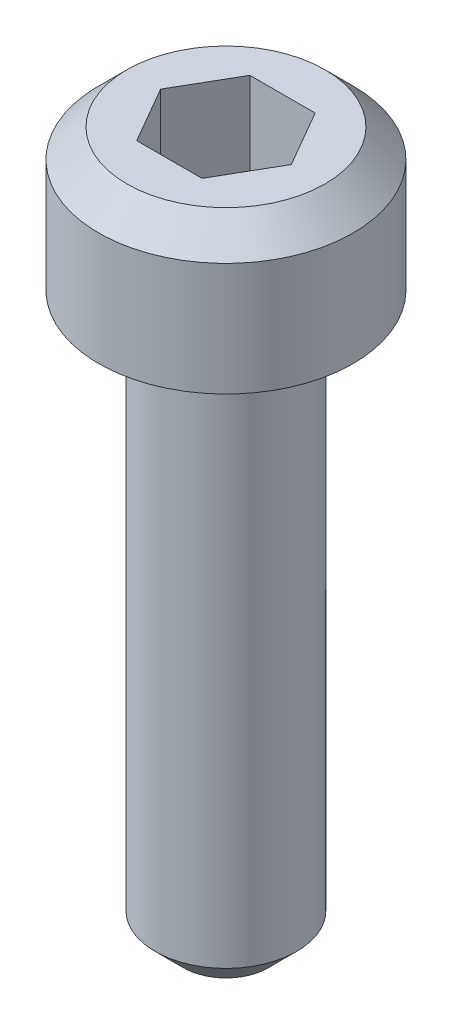
ISO-10303-21;
HEADER;
FILE_DESCRIPTION(('STEP AP214'),'2;1');
FILE_NAME('part.step','',(''),(''),'','','');
FILE_SCHEMA(('AUTOMOTIVE_DESIGN { 1 0 10303 214 1 1 1 1 }'));
ENDSEC;
DATA;
#1=APPLICATION_CONTEXT('core data for automotive mechanical design processes');
#2=APPLICATION_PROTOCOL_DEFINITION('international standard','automotive_design',2000,#1);
#3=PRODUCT_CONTEXT('',#1,'mechanical');
#4=PRODUCT('Part','Part','',(#3));
#5=PRODUCT_RELATED_PRODUCT_CATEGORY('part','',(#4));
#6=PRODUCT_DEFINITION_FORMATION('','',#4);
#7=PRODUCT_DEFINITION_CONTEXT('part definition',#1,'design');
#8=PRODUCT_DEFINITION('design','',#6,#7);
#9=PRODUCT_DEFINITION_SHAPE('','',#8);
#10=(LENGTH_UNIT() NAMED_UNIT(*) SI_UNIT(.MILLI.,.METRE.));
#11=(NAMED_UNIT(*) PLANE_ANGLE_UNIT() SI_UNIT($,.RADIAN.));
#12=(NAMED_UNIT(*) SI_UNIT($,.STERADIAN.) SOLID_ANGLE_UNIT());
#13=UNCERTAINTY_MEASURE_WITH_UNIT(LENGTH_MEASURE(1.E-05),#10,'distance_accuracy_value','');
#14=(GEOMETRIC_REPRESENTATION_CONTEXT(3) GLOBAL_UNCERTAINTY_ASSIGNED_CONTEXT((#13)) GLOBAL_UNIT_ASSIGNED_CONTEXT((#10,
#11,#12)) REPRESENTATION_CONTEXT('',''));
#15=CARTESIAN_POINT('',(0.,0.,0.));
#16=DIRECTION('',(0.,0.,1.));
#17=DIRECTION('',(1.,0.,0.));
#18=AXIS2_PLACEMENT_3D('',#15,#16,#17);
#19=CARTESIAN_POINT('',(0.,12.5,0.));
#20=DIRECTION('',(0.,-1.,0.));
#21=DIRECTION('',(0.,0.,-1.));
#22=AXIS2_PLACEMENT_3D('',#19,#20,#21);
#23=PLANE('',#22);
#24=DIRECTION('',(0.5,0.,0.866025403784439));
#25=VECTOR('',#24,1.);
#26=CARTESIAN_POINT('',(-1.15470053837925,12.5,0.));
#27=LINE('',#26,#25);
#28=CARTESIAN_POINT('',(-1.15470053837925,12.5,0.));
#29=VERTEX_POINT('',#28);
#30=CARTESIAN_POINT('',(-0.577350269189626,12.5,1.));
#31=VERTEX_POINT('',#30);
#32=EDGE_CURVE('E127',#29,#31,#27,.T.);
#33=ORIENTED_EDGE('',*,*,#32,.F.);
#34=DIRECTION('',(-0.5,0.,0.866025403784439));
#35=VECTOR('',#34,1.);
#36=CARTESIAN_POINT('',(-0.577350269189626,12.5,-1.));
#37=LINE('',#36,#35);
#38=CARTESIAN_POINT('',(-0.577350269189626,12.5,-1.));
#39=VERTEX_POINT('',#38);
#40=EDGE_CURVE('E53',#39,#29,#37,.T.);
#41=ORIENTED_EDGE('',*,*,#40,.F.);
#42=DIRECTION('',(-1.,0.,0.));
#43=VECTOR('',#42,1.);
#44=CARTESIAN_POINT('',(0.577350269189625,12.5,-1.));
#45=LINE('',#44,#43);
#46=CARTESIAN_POINT('',(0.577350269189625,12.5,-1.));
#47=VERTEX_POINT('',#46);
#48=EDGE_CURVE('E136',#47,#39,#45,.T.);
#49=ORIENTED_EDGE('',*,*,#48,.F.);
#50=DIRECTION('',(-0.5,0.,-0.866025403784439));
#51=VECTOR('',#50,1.);
#52=CARTESIAN_POINT('',(1.15470053837925,12.5,0.));
#53=LINE('',#52,#51);
#54=CARTESIAN_POINT('',(1.15470053837925,12.5,0.));
#55=VERTEX_POINT('',#54);
#56=EDGE_CURVE('E134',#55,#47,#53,.T.);
#57=ORIENTED_EDGE('',*,*,#56,.F.);
#58=DIRECTION('',(0.499999999999999,0.,-0.866025403784439));
#59=VECTOR('',#58,1.);
#60=CARTESIAN_POINT('',(0.577350269189626,12.5,1.));
#61=LINE('',#60,#59);
#62=CARTESIAN_POINT('',(0.577350269189626,12.5,1.));
#63=VERTEX_POINT('',#62);
#64=EDGE_CURVE('E101',#63,#55,#61,.T.);
#65=ORIENTED_EDGE('',*,*,#64,.F.);
#66=DIRECTION('',(1.,0.,0.));
#67=VECTOR('',#66,1.);
#68=CARTESIAN_POINT('',(-0.577350269189626,12.5,1.));
#69=LINE('',#68,#67);
#70=EDGE_CURVE('E130',#31,#63,#69,.T.);
#71=ORIENTED_EDGE('',*,*,#70,.F.);
#72=EDGE_LOOP('',(#33,#41,#49,#57,#65,#71));
#73=FACE_BOUND('',#72,.T.);
#74=CARTESIAN_POINT('',(0.,12.5,0.));
#75=DIRECTION('',(0.,-1.,0.));
#76=DIRECTION('',(0.,0.,-1.));
#77=AXIS2_PLACEMENT_3D('',#74,#75,#76);
#78=CIRCLE('',#77,1.75);
#79=CARTESIAN_POINT('',(0.,12.5,-1.75));
#80=VERTEX_POINT('',#79);
#81=EDGE_CURVE('E11',#80,#80,#78,.T.);
#82=ORIENTED_EDGE('',*,*,#81,.F.);
#83=EDGE_LOOP('',(#82));
#84=FACE_BOUND('',#83,.T.);
#85=ADVANCED_FACE('F39',(#73,#84),#23,.F.);
#86=CARTESIAN_POINT('',(0.,12.5,0.));
#87=DIRECTION('',(0.,-1.,0.));
#88=DIRECTION('',(0.,0.,-1.));
#89=AXIS2_PLACEMENT_3D('',#86,#87,#88);
#90=CONICAL_SURFACE('',#89,1.75,0.785398163397447);
#91=CARTESIAN_POINT('',(0.,12.,0.));
#92=DIRECTION('',(0.,-1.,0.));
#93=DIRECTION('',(0.,0.,-1.));
#94=AXIS2_PLACEMENT_3D('',#91,#92,#93);
#95=CIRCLE('',#94,2.25);
#96=CARTESIAN_POINT('',(0.,12.,-2.25));
#97=VERTEX_POINT('',#96);
#98=EDGE_CURVE('E46',#97,#97,#95,.T.);
#99=ORIENTED_EDGE('',*,*,#98,.F.);
#100=EDGE_LOOP('',(#99));
#101=FACE_BOUND('',#100,.T.);
#102=ORIENTED_EDGE('',*,*,#81,.T.);
#103=EDGE_LOOP('',(#102));
#104=FACE_BOUND('',#103,.T.);
#105=ADVANCED_FACE('F161',(#101,#104),#90,.T.);
#106=CARTESIAN_POINT('',(0.,0.,0.));
#107=DIRECTION('',(0.,-1.,0.));
#108=DIRECTION('',(0.,0.,-1.));
#109=AXIS2_PLACEMENT_3D('',#106,#107,#108);
#110=CYLINDRICAL_SURFACE('',#109,2.25);
#111=CARTESIAN_POINT('',(0.,10.,0.));
#112=DIRECTION('',(0.,-1.,0.));
#113=DIRECTION('',(0.,0.,-1.));
#114=AXIS2_PLACEMENT_3D('',#111,#112,#113);
#115=CIRCLE('',#114,2.25);
#116=CARTESIAN_POINT('',(0.,10.,-2.25));
#117=VERTEX_POINT('',#116);
#118=EDGE_CURVE('E154',#117,#117,#115,.T.);
#119=ORIENTED_EDGE('',*,*,#118,.F.);
#120=EDGE_LOOP('',(#119));
#121=FACE_BOUND('',#120,.T.);
#122=ORIENTED_EDGE('',*,*,#98,.T.);
#123=EDGE_LOOP('',(#122));
#124=FACE_BOUND('',#123,.T.);
#125=ADVANCED_FACE('F159',(#121,#124),#110,.T.);
#126=CARTESIAN_POINT('',(-2.25,10.,0.));
#127=DIRECTION('',(0.,1.,0.));
#128=DIRECTION('',(0.,0.,1.));
#129=AXIS2_PLACEMENT_3D('',#126,#127,#128);
#130=PLANE('',#129);
#131=CARTESIAN_POINT('',(0.,10.,0.));
#132=DIRECTION('',(0.,-1.,0.));
#133=DIRECTION('',(0.,0.,-1.));
#134=AXIS2_PLACEMENT_3D('',#131,#132,#133);
#135=CIRCLE('',#134,1.25);
#136=CARTESIAN_POINT('',(0.,10.,-1.25));
#137=VERTEX_POINT('',#136);
#138=EDGE_CURVE('E151',#137,#137,#135,.T.);
#139=ORIENTED_EDGE('',*,*,#138,.F.);
#140=EDGE_LOOP('',(#139));
#141=FACE_BOUND('',#140,.T.);
#142=ORIENTED_EDGE('',*,*,#118,.T.);
#143=EDGE_LOOP('',(#142));
#144=FACE_BOUND('',#143,.T.);
#145=ADVANCED_FACE('F198',(#141,#144),#130,.F.);
#146=CARTESIAN_POINT('',(0.,0.,0.));
#147=DIRECTION('',(0.,-1.,0.));
#148=DIRECTION('',(0.,0.,-1.));
#149=AXIS2_PLACEMENT_3D('',#146,#147,#148);
#150=CYLINDRICAL_SURFACE('',#149,1.25);
#151=CARTESIAN_POINT('',(0.,0.5,0.));
#152=DIRECTION('',(0.,-1.,0.));
#153=DIRECTION('',(0.,0.,-1.));
#154=AXIS2_PLACEMENT_3D('',#151,#152,#153);
#155=CIRCLE('',#154,1.25);
#156=CARTESIAN_POINT('',(0.,0.5,-1.25));
#157=VERTEX_POINT('',#156);
#158=EDGE_CURVE('E148',#157,#157,#155,.T.);
#159=ORIENTED_EDGE('',*,*,#158,.F.);
#160=EDGE_LOOP('',(#159));
#161=FACE_BOUND('',#160,.T.);
#162=ORIENTED_EDGE('',*,*,#138,.T.);
#163=EDGE_LOOP('',(#162));
#164=FACE_BOUND('',#163,.T.);
#165=ADVANCED_FACE('F194',(#161,#164),#150,.T.);
#166=CARTESIAN_POINT('',(0.,0.5,0.));
#167=DIRECTION('',(0.,1.,0.));
#168=DIRECTION('',(0.,0.,1.));
#169=AXIS2_PLACEMENT_3D('',#166,#167,#168);
#170=CONICAL_SURFACE('',#169,1.25,0.785398163397448);
#171=CARTESIAN_POINT('',(0.,0.,0.));
#172=DIRECTION('',(0.,-1.,0.));
#173=DIRECTION('',(0.,0.,-1.));
#174=AXIS2_PLACEMENT_3D('',#171,#172,#173);
#175=CIRCLE('',#174,0.749999999999999);
#176=CARTESIAN_POINT('',(0.,0.,-0.749999999999999));
#177=VERTEX_POINT('',#176);
#178=EDGE_CURVE('E140',#177,#177,#175,.T.);
#179=ORIENTED_EDGE('',*,*,#178,.F.);
#180=EDGE_LOOP('',(#179));
#181=FACE_BOUND('',#180,.T.);
#182=ORIENTED_EDGE('',*,*,#158,.T.);
#183=EDGE_LOOP('',(#182));
#184=FACE_BOUND('',#183,.T.);
#185=ADVANCED_FACE('F186',(#181,#184),#170,.T.);
#186=CARTESIAN_POINT('',(-0.749999999999999,0.,0.));
#187=DIRECTION('',(0.,1.,0.));
#188=DIRECTION('',(0.,0.,1.));
#189=AXIS2_PLACEMENT_3D('',#186,#187,#188);
#190=PLANE('',#189);
#191=ORIENTED_EDGE('',*,*,#178,.T.);
#192=EDGE_LOOP('',(#191));
#193=FACE_BOUND('',#192,.T.);
#194=ADVANCED_FACE('F179',(#193),#190,.F.);
#195=CARTESIAN_POINT('',(-0.577350269189626,11.,-1.));
#196=DIRECTION('',(-0.866025403784439,0.,-0.5));
#197=DIRECTION('',(-0.5,0.,0.866025403784439));
#198=AXIS2_PLACEMENT_3D('',#195,#196,#197);
#199=PLANE('',#198);
#200=ORIENTED_EDGE('',*,*,#40,.T.);
#201=DIRECTION('',(0.,1.,0.));
#202=VECTOR('',#201,1.);
#203=CARTESIAN_POINT('',(-1.15470053837925,11.,0.));
#204=LINE('',#203,#202);
#205=CARTESIAN_POINT('',(-1.15470053837925,11.,0.));
#206=VERTEX_POINT('',#205);
#207=EDGE_CURVE('E83',#206,#29,#204,.T.);
#208=ORIENTED_EDGE('',*,*,#207,.F.);
#209=DIRECTION('',(-0.5,0.,0.866025403784439));
#210=VECTOR('',#209,1.);
#211=CARTESIAN_POINT('',(-0.577350269189626,11.,-1.));
#212=LINE('',#211,#210);
#213=CARTESIAN_POINT('',(-0.577350269189626,11.,-1.));
#214=VERTEX_POINT('',#213);
#215=EDGE_CURVE('E138',#214,#206,#212,.T.);
#216=ORIENTED_EDGE('',*,*,#215,.F.);
#217=DIRECTION('',(0.,1.,0.));
#218=VECTOR('',#217,1.);
#219=CARTESIAN_POINT('',(-0.577350269189626,11.,-1.));
#220=LINE('',#219,#218);
#221=EDGE_CURVE('E61',#214,#39,#220,.T.);
#222=ORIENTED_EDGE('',*,*,#221,.T.);
#223=EDGE_LOOP('',(#200,#208,#216,#222));
#224=FACE_BOUND('',#223,.T.);
#225=ADVANCED_FACE('F176',(#224),#199,.F.);
#226=CARTESIAN_POINT('',(0.577350269189625,11.,-1.));
#227=DIRECTION('',(0.,0.,-1.));
#228=DIRECTION('',(-1.,0.,0.));
#229=AXIS2_PLACEMENT_3D('',#226,#227,#228);
#230=PLANE('',#229);
#231=ORIENTED_EDGE('',*,*,#48,.T.);
#232=ORIENTED_EDGE('',*,*,#221,.F.);
#233=DIRECTION('',(-1.,0.,0.));
#234=VECTOR('',#233,1.);
#235=CARTESIAN_POINT('',(0.577350269189625,11.,-1.));
#236=LINE('',#235,#234);
#237=CARTESIAN_POINT('',(0.577350269189625,11.,-1.));
#238=VERTEX_POINT('',#237);
#239=EDGE_CURVE('E113',#238,#214,#236,.T.);
#240=ORIENTED_EDGE('',*,*,#239,.F.);
#241=DIRECTION('',(0.,1.,0.));
#242=VECTOR('',#241,1.);
#243=CARTESIAN_POINT('',(0.577350269189625,11.,-1.));
#244=LINE('',#243,#242);
#245=EDGE_CURVE('E105',#238,#47,#244,.T.);
#246=ORIENTED_EDGE('',*,*,#245,.T.);
#247=EDGE_LOOP('',(#231,#232,#240,#246));
#248=FACE_BOUND('',#247,.T.);
#249=ADVANCED_FACE('F178',(#248),#230,.F.);
#250=CARTESIAN_POINT('',(1.15470053837925,11.,0.));
#251=DIRECTION('',(0.866025403784439,0.,-0.5));
#252=DIRECTION('',(-0.5,0.,-0.866025403784439));
#253=AXIS2_PLACEMENT_3D('',#250,#251,#252);
#254=PLANE('',#253);
#255=ORIENTED_EDGE('',*,*,#56,.T.);
#256=ORIENTED_EDGE('',*,*,#245,.F.);
#257=DIRECTION('',(-0.5,0.,-0.866025403784439));
#258=VECTOR('',#257,1.);
#259=CARTESIAN_POINT('',(1.15470053837925,11.,0.));
#260=LINE('',#259,#258);
#261=CARTESIAN_POINT('',(1.15470053837925,11.,0.));
#262=VERTEX_POINT('',#261);
#263=EDGE_CURVE('E109',#262,#238,#260,.T.);
#264=ORIENTED_EDGE('',*,*,#263,.F.);
#265=DIRECTION('',(0.,1.,0.));
#266=VECTOR('',#265,1.);
#267=CARTESIAN_POINT('',(1.15470053837925,11.,0.));
#268=LINE('',#267,#266);
#269=EDGE_CURVE('E94',#262,#55,#268,.T.);
#270=ORIENTED_EDGE('',*,*,#269,.T.);
#271=EDGE_LOOP('',(#255,#256,#264,#270));
#272=FACE_BOUND('',#271,.T.);
#273=ADVANCED_FACE('F110',(#272),#254,.F.);
#274=CARTESIAN_POINT('',(0.577350269189626,11.,1.));
#275=DIRECTION('',(0.866025403784439,0.,0.5));
#276=DIRECTION('',(0.5,0.,-0.866025403784439));
#277=AXIS2_PLACEMENT_3D('',#274,#275,#276);
#278=PLANE('',#277);
#279=ORIENTED_EDGE('',*,*,#64,.T.);
#280=ORIENTED_EDGE('',*,*,#269,.F.);
#281=DIRECTION('',(0.499999999999999,0.,-0.866025403784439));
#282=VECTOR('',#281,1.);
#283=CARTESIAN_POINT('',(0.577350269189626,11.,1.));
#284=LINE('',#283,#282);
#285=CARTESIAN_POINT('',(0.577350269189626,11.,1.));
#286=VERTEX_POINT('',#285);
#287=EDGE_CURVE('E98',#286,#262,#284,.T.);
#288=ORIENTED_EDGE('',*,*,#287,.F.);
#289=DIRECTION('',(0.,1.,0.));
#290=VECTOR('',#289,1.);
#291=CARTESIAN_POINT('',(0.577350269189626,11.,1.));
#292=LINE('',#291,#290);
#293=EDGE_CURVE('E106',#286,#63,#292,.T.);
#294=ORIENTED_EDGE('',*,*,#293,.T.);
#295=EDGE_LOOP('',(#279,#280,#288,#294));
#296=FACE_BOUND('',#295,.T.);
#297=ADVANCED_FACE('F96',(#296),#278,.F.);
#298=CARTESIAN_POINT('',(-0.577350269189626,11.,1.));
#299=DIRECTION('',(0.,0.,1.));
#300=DIRECTION('',(1.,0.,0.));
#301=AXIS2_PLACEMENT_3D('',#298,#299,#300);
#302=PLANE('',#301);
#303=ORIENTED_EDGE('',*,*,#70,.T.);
#304=ORIENTED_EDGE('',*,*,#293,.F.);
#305=DIRECTION('',(1.,0.,0.));
#306=VECTOR('',#305,1.);
#307=CARTESIAN_POINT('',(-0.577350269189626,11.,1.));
#308=LINE('',#307,#306);
#309=CARTESIAN_POINT('',(-0.577350269189626,11.,1.));
#310=VERTEX_POINT('',#309);
#311=EDGE_CURVE('E119',#310,#286,#308,.T.);
#312=ORIENTED_EDGE('',*,*,#311,.F.);
#313=DIRECTION('',(0.,1.,0.));
#314=VECTOR('',#313,1.);
#315=CARTESIAN_POINT('',(-0.577350269189626,11.,1.));
#316=LINE('',#315,#314);
#317=EDGE_CURVE('E143',#310,#31,#316,.T.);
#318=ORIENTED_EDGE('',*,*,#317,.T.);
#319=EDGE_LOOP('',(#303,#304,#312,#318));
#320=FACE_BOUND('',#319,.T.);
#321=ADVANCED_FACE('F264',(#320),#302,.F.);
#322=CARTESIAN_POINT('',(-1.15470053837925,11.,0.));
#323=DIRECTION('',(-0.866025403784439,0.,0.5));
#324=DIRECTION('',(0.5,0.,0.866025403784439));
#325=AXIS2_PLACEMENT_3D('',#322,#323,#324);
#326=PLANE('',#325);
#327=ORIENTED_EDGE('',*,*,#32,.T.);
#328=ORIENTED_EDGE('',*,*,#317,.F.);
#329=DIRECTION('',(0.5,0.,0.866025403784439));
#330=VECTOR('',#329,1.);
#331=CARTESIAN_POINT('',(-1.15470053837925,11.,0.));
#332=LINE('',#331,#330);
#333=EDGE_CURVE('E121',#206,#310,#332,.T.);
#334=ORIENTED_EDGE('',*,*,#333,.F.);
#335=ORIENTED_EDGE('',*,*,#207,.T.);
#336=EDGE_LOOP('',(#327,#328,#334,#335));
#337=FACE_BOUND('',#336,.T.);
#338=ADVANCED_FACE('F174',(#337),#326,.F.);
#339=CARTESIAN_POINT('',(0.,11.,0.));
#340=DIRECTION('',(0.,1.,0.));
#341=DIRECTION('',(0.,0.,1.));
#342=AXIS2_PLACEMENT_3D('',#339,#340,#341);
#343=PLANE('',#342);
#344=ORIENTED_EDGE('',*,*,#215,.T.);
#345=ORIENTED_EDGE('',*,*,#333,.T.);
#346=ORIENTED_EDGE('',*,*,#311,.T.);
#347=ORIENTED_EDGE('',*,*,#287,.T.);
#348=ORIENTED_EDGE('',*,*,#263,.T.);
#349=ORIENTED_EDGE('',*,*,#239,.T.);
#350=EDGE_LOOP('',(#344,#345,#346,#347,#348,#349));
#351=FACE_BOUND('',#350,.T.);
#352=ADVANCED_FACE('F116',(#351),#343,.T.);
#353=CLOSED_SHELL('',(#85,#105,#125,#145,#165,#185,#194,#225,#249,#273,#297,#321,#338,#352));
#354=MANIFOLD_SOLID_BREP('B2',#353);
#355=ADVANCED_BREP_SHAPE_REPRESENTATION('',(#18,#354),#14);
#356=SHAPE_DEFINITION_REPRESENTATION(#9,#355);
ENDSEC;
END-ISO-10303-21;
